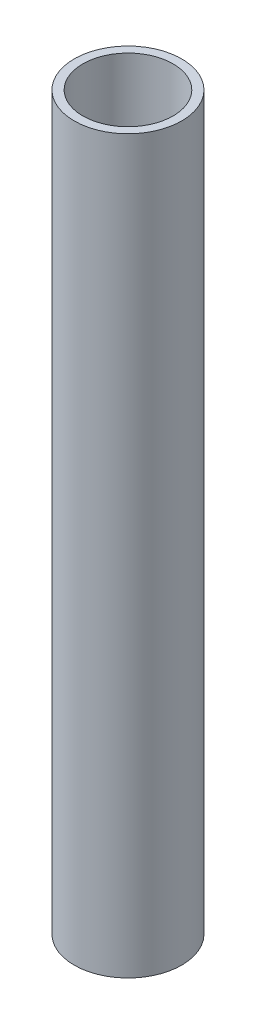
ISO-10303-21;
HEADER;
FILE_DESCRIPTION(('STEP AP214'),'2;1');
FILE_NAME('part.step','',(''),(''),'','','');
FILE_SCHEMA(('AUTOMOTIVE_DESIGN { 1 0 10303 214 1 1 1 1 }'));
ENDSEC;
DATA;
#1=APPLICATION_CONTEXT('core data for automotive mechanical design processes');
#2=APPLICATION_PROTOCOL_DEFINITION('international standard','automotive_design',2000,#1);
#3=PRODUCT_CONTEXT('',#1,'mechanical');
#4=PRODUCT('Part','Part','',(#3));
#5=PRODUCT_RELATED_PRODUCT_CATEGORY('part','',(#4));
#6=PRODUCT_DEFINITION_FORMATION('','',#4);
#7=PRODUCT_DEFINITION_CONTEXT('part definition',#1,'design');
#8=PRODUCT_DEFINITION('design','',#6,#7);
#9=PRODUCT_DEFINITION_SHAPE('','',#8);
#10=(LENGTH_UNIT() NAMED_UNIT(*) SI_UNIT(.MILLI.,.METRE.));
#11=(NAMED_UNIT(*) PLANE_ANGLE_UNIT() SI_UNIT($,.RADIAN.));
#12=(NAMED_UNIT(*) SI_UNIT($,.STERADIAN.) SOLID_ANGLE_UNIT());
#13=UNCERTAINTY_MEASURE_WITH_UNIT(LENGTH_MEASURE(1.E-05),#10,'distance_accuracy_value','');
#14=(GEOMETRIC_REPRESENTATION_CONTEXT(3) GLOBAL_UNCERTAINTY_ASSIGNED_CONTEXT((#13)) GLOBAL_UNIT_ASSIGNED_CONTEXT((#10,
#11,#12)) REPRESENTATION_CONTEXT('',''));
#15=CARTESIAN_POINT('',(0.,0.,0.));
#16=DIRECTION('',(0.,0.,1.));
#17=DIRECTION('',(1.,0.,0.));
#18=AXIS2_PLACEMENT_3D('',#15,#16,#17);
#19=CARTESIAN_POINT('',(0.,170.,0.));
#20=DIRECTION('',(0.,1.,0.));
#21=DIRECTION('',(0.,0.,1.));
#22=AXIS2_PLACEMENT_3D('',#19,#20,#21);
#23=PLANE('',#22);
#24=CARTESIAN_POINT('',(0.,170.,0.));
#25=DIRECTION('',(0.,1.,0.));
#26=DIRECTION('',(0.,0.,1.));
#27=AXIS2_PLACEMENT_3D('',#24,#25,#26);
#28=CIRCLE('',#27,12.5);
#29=CARTESIAN_POINT('',(0.,170.,12.5));
#30=VERTEX_POINT('',#29);
#31=EDGE_CURVE('E10',#30,#30,#28,.T.);
#32=ORIENTED_EDGE('',*,*,#31,.T.);
#33=EDGE_LOOP('',(#32));
#34=FACE_BOUND('',#33,.T.);
#35=CARTESIAN_POINT('',(0.,170.,0.));
#36=DIRECTION('',(0.,1.,0.));
#37=DIRECTION('',(0.,0.,1.));
#38=AXIS2_PLACEMENT_3D('',#35,#36,#37);
#39=CIRCLE('',#38,10.5);
#40=CARTESIAN_POINT('',(0.,170.,10.5));
#41=VERTEX_POINT('',#40);
#42=EDGE_CURVE('E42',#41,#41,#39,.T.);
#43=ORIENTED_EDGE('',*,*,#42,.F.);
#44=EDGE_LOOP('',(#43));
#45=FACE_BOUND('',#44,.T.);
#46=ADVANCED_FACE('F31',(#34,#45),#23,.T.);
#47=CARTESIAN_POINT('',(0.,0.,0.));
#48=DIRECTION('',(0.,1.,0.));
#49=DIRECTION('',(0.,0.,1.));
#50=AXIS2_PLACEMENT_3D('',#47,#48,#49);
#51=PLANE('',#50);
#52=CARTESIAN_POINT('',(0.,0.,0.));
#53=DIRECTION('',(0.,1.,0.));
#54=DIRECTION('',(0.,0.,1.));
#55=AXIS2_PLACEMENT_3D('',#52,#53,#54);
#56=CIRCLE('',#55,12.5);
#57=CARTESIAN_POINT('',(0.,0.,12.5));
#58=VERTEX_POINT('',#57);
#59=EDGE_CURVE('E35',#58,#58,#56,.T.);
#60=ORIENTED_EDGE('',*,*,#59,.F.);
#61=EDGE_LOOP('',(#60));
#62=FACE_BOUND('',#61,.T.);
#63=CARTESIAN_POINT('',(0.,0.,0.));
#64=DIRECTION('',(0.,1.,0.));
#65=DIRECTION('',(0.,0.,1.));
#66=AXIS2_PLACEMENT_3D('',#63,#64,#65);
#67=CIRCLE('',#66,10.5);
#68=CARTESIAN_POINT('',(0.,0.,10.5));
#69=VERTEX_POINT('',#68);
#70=EDGE_CURVE('E44',#69,#69,#67,.T.);
#71=ORIENTED_EDGE('',*,*,#70,.T.);
#72=EDGE_LOOP('',(#71));
#73=FACE_BOUND('',#72,.T.);
#74=ADVANCED_FACE('F54',(#62,#73),#51,.F.);
#75=CARTESIAN_POINT('',(0.,170.,0.));
#76=DIRECTION('',(0.,-1.,0.));
#77=DIRECTION('',(0.,0.,-1.));
#78=AXIS2_PLACEMENT_3D('',#75,#76,#77);
#79=CYLINDRICAL_SURFACE('',#78,12.5);
#80=ORIENTED_EDGE('',*,*,#31,.F.);
#81=EDGE_LOOP('',(#80));
#82=FACE_BOUND('',#81,.T.);
#83=ORIENTED_EDGE('',*,*,#59,.T.);
#84=EDGE_LOOP('',(#83));
#85=FACE_BOUND('',#84,.T.);
#86=ADVANCED_FACE('F33',(#82,#85),#79,.T.);
#87=CARTESIAN_POINT('',(0.,170.,0.));
#88=DIRECTION('',(0.,-1.,0.));
#89=DIRECTION('',(0.,0.,-1.));
#90=AXIS2_PLACEMENT_3D('',#87,#88,#89);
#91=CYLINDRICAL_SURFACE('',#90,10.5);
#92=ORIENTED_EDGE('',*,*,#42,.T.);
#93=EDGE_LOOP('',(#92));
#94=FACE_BOUND('',#93,.T.);
#95=ORIENTED_EDGE('',*,*,#70,.F.);
#96=EDGE_LOOP('',(#95));
#97=FACE_BOUND('',#96,.T.);
#98=ADVANCED_FACE('F50',(#94,#97),#91,.F.);
#99=CLOSED_SHELL('',(#46,#74,#86,#98));
#100=MANIFOLD_SOLID_BREP('B2',#99);
#101=ADVANCED_BREP_SHAPE_REPRESENTATION('',(#18,#100),#14);
#102=SHAPE_DEFINITION_REPRESENTATION(#9,#101);
ENDSEC;
END-ISO-10303-21;
